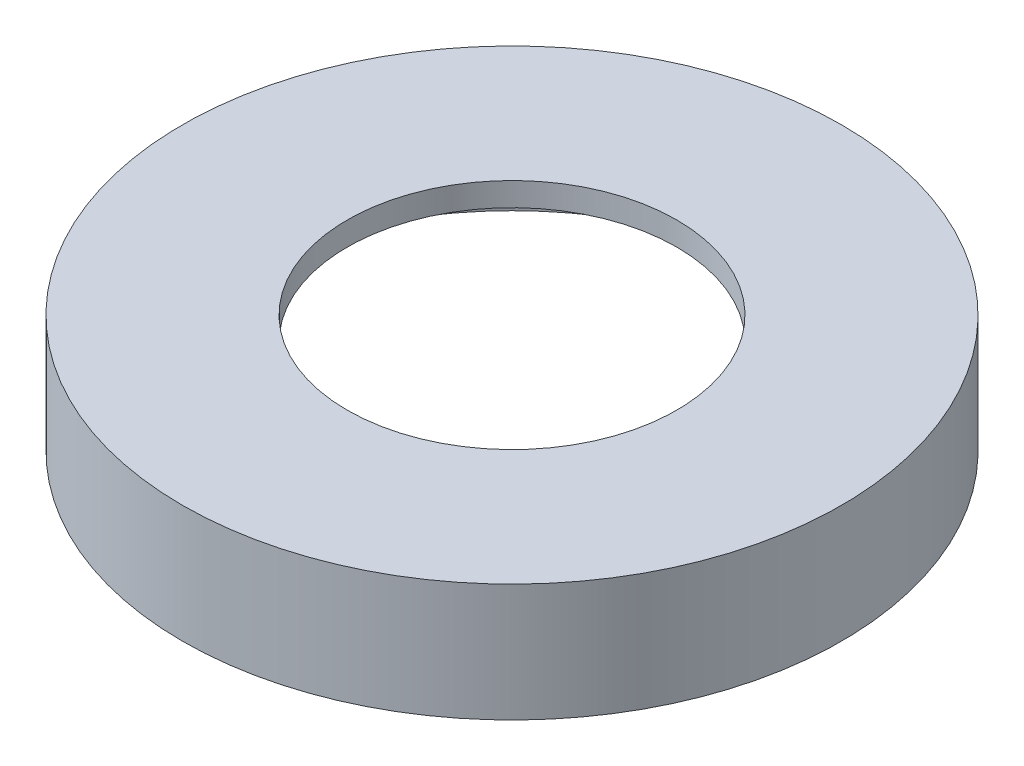
ISO-10303-21;
HEADER;
FILE_DESCRIPTION(('STEP AP214'),'2;1');
FILE_NAME('part.step','',(''),(''),'','','');
FILE_SCHEMA(('AUTOMOTIVE_DESIGN { 1 0 10303 214 1 1 1 1 }'));
ENDSEC;
DATA;
#1=APPLICATION_CONTEXT('core data for automotive mechanical design processes');
#2=APPLICATION_PROTOCOL_DEFINITION('international standard','automotive_design',2000,#1);
#3=PRODUCT_CONTEXT('',#1,'mechanical');
#4=PRODUCT('Part','Part','',(#3));
#5=PRODUCT_RELATED_PRODUCT_CATEGORY('part','',(#4));
#6=PRODUCT_DEFINITION_FORMATION('','',#4);
#7=PRODUCT_DEFINITION_CONTEXT('part definition',#1,'design');
#8=PRODUCT_DEFINITION('design','',#6,#7);
#9=PRODUCT_DEFINITION_SHAPE('','',#8);
#10=(LENGTH_UNIT() NAMED_UNIT(*) SI_UNIT(.MILLI.,.METRE.));
#11=(NAMED_UNIT(*) PLANE_ANGLE_UNIT() SI_UNIT($,.RADIAN.));
#12=(NAMED_UNIT(*) SI_UNIT($,.STERADIAN.) SOLID_ANGLE_UNIT());
#13=UNCERTAINTY_MEASURE_WITH_UNIT(LENGTH_MEASURE(1.E-05),#10,'distance_accuracy_value','');
#14=(GEOMETRIC_REPRESENTATION_CONTEXT(3) GLOBAL_UNCERTAINTY_ASSIGNED_CONTEXT((#13)) GLOBAL_UNIT_ASSIGNED_CONTEXT((#10,
#11,#12)) REPRESENTATION_CONTEXT('',''));
#15=CARTESIAN_POINT('',(0.,0.,0.));
#16=DIRECTION('',(0.,0.,1.));
#17=DIRECTION('',(1.,0.,0.));
#18=AXIS2_PLACEMENT_3D('',#15,#16,#17);
#19=CARTESIAN_POINT('',(0.,5.,0.));
#20=DIRECTION('',(0.,1.,0.));
#21=DIRECTION('',(0.,0.,1.));
#22=AXIS2_PLACEMENT_3D('',#19,#20,#21);
#23=PLANE('',#22);
#24=CARTESIAN_POINT('',(0.,5.,0.));
#25=DIRECTION('',(0.,1.,0.));
#26=DIRECTION('',(0.,0.,1.));
#27=AXIS2_PLACEMENT_3D('',#24,#25,#26);
#28=CIRCLE('',#27,7.);
#29=CARTESIAN_POINT('',(0.,5.,7.));
#30=VERTEX_POINT('',#29);
#31=EDGE_CURVE('E36',#30,#30,#28,.T.);
#32=ORIENTED_EDGE('',*,*,#31,.F.);
#33=EDGE_LOOP('',(#32));
#34=FACE_BOUND('',#33,.T.);
#35=CARTESIAN_POINT('',(0.,5.,0.));
#36=DIRECTION('',(0.,-1.,0.));
#37=DIRECTION('',(0.,0.,-1.));
#38=AXIS2_PLACEMENT_3D('',#35,#36,#37);
#39=CIRCLE('',#38,14.);
#40=CARTESIAN_POINT('',(0.,5.,-14.));
#41=VERTEX_POINT('',#40);
#42=EDGE_CURVE('E10',#41,#41,#39,.T.);
#43=ORIENTED_EDGE('',*,*,#42,.F.);
#44=EDGE_LOOP('',(#43));
#45=FACE_BOUND('',#44,.T.);
#46=ADVANCED_FACE('F33',(#34,#45),#23,.T.);
#47=CARTESIAN_POINT('',(0.,0.,0.));
#48=DIRECTION('',(0.,-1.,0.));
#49=DIRECTION('',(0.,0.,-1.));
#50=AXIS2_PLACEMENT_3D('',#47,#48,#49);
#51=CYLINDRICAL_SURFACE('',#50,14.);
#52=ORIENTED_EDGE('',*,*,#42,.T.);
#53=EDGE_LOOP('',(#52));
#54=FACE_BOUND('',#53,.T.);
#55=CARTESIAN_POINT('',(0.,0.,0.));
#56=DIRECTION('',(0.,-1.,0.));
#57=DIRECTION('',(0.,0.,-1.));
#58=AXIS2_PLACEMENT_3D('',#55,#56,#57);
#59=CIRCLE('',#58,14.);
#60=CARTESIAN_POINT('',(0.,0.,-14.));
#61=VERTEX_POINT('',#60);
#62=EDGE_CURVE('E40',#61,#61,#59,.T.);
#63=ORIENTED_EDGE('',*,*,#62,.F.);
#64=EDGE_LOOP('',(#63));
#65=FACE_BOUND('',#64,.T.);
#66=ADVANCED_FACE('F63',(#54,#65),#51,.T.);
#67=CARTESIAN_POINT('',(14.,0.,0.));
#68=DIRECTION('',(0.,-1.,0.));
#69=DIRECTION('',(0.,0.,-1.));
#70=AXIS2_PLACEMENT_3D('',#67,#68,#69);
#71=PLANE('',#70);
#72=ORIENTED_EDGE('',*,*,#62,.T.);
#73=EDGE_LOOP('',(#72));
#74=FACE_BOUND('',#73,.T.);
#75=CARTESIAN_POINT('',(0.,0.,0.));
#76=DIRECTION('',(0.,-1.,0.));
#77=DIRECTION('',(0.,0.,-1.));
#78=AXIS2_PLACEMENT_3D('',#75,#76,#77);
#79=CIRCLE('',#78,12.5);
#80=CARTESIAN_POINT('',(0.,0.,-12.5));
#81=VERTEX_POINT('',#80);
#82=EDGE_CURVE('E44',#81,#81,#79,.T.);
#83=ORIENTED_EDGE('',*,*,#82,.F.);
#84=EDGE_LOOP('',(#83));
#85=FACE_BOUND('',#84,.T.);
#86=ADVANCED_FACE('F67',(#74,#85),#71,.T.);
#87=CARTESIAN_POINT('',(0.,0.,0.));
#88=DIRECTION('',(0.,-1.,0.));
#89=DIRECTION('',(0.,0.,-1.));
#90=AXIS2_PLACEMENT_3D('',#87,#88,#89);
#91=CYLINDRICAL_SURFACE('',#90,12.5);
#92=ORIENTED_EDGE('',*,*,#82,.T.);
#93=EDGE_LOOP('',(#92));
#94=FACE_BOUND('',#93,.T.);
#95=CARTESIAN_POINT('',(0.,4.,0.));
#96=DIRECTION('',(0.,-1.,0.));
#97=DIRECTION('',(0.,0.,-1.));
#98=AXIS2_PLACEMENT_3D('',#95,#96,#97);
#99=CIRCLE('',#98,12.5);
#100=CARTESIAN_POINT('',(0.,4.,-12.5));
#101=VERTEX_POINT('',#100);
#102=EDGE_CURVE('E49',#101,#101,#99,.T.);
#103=ORIENTED_EDGE('',*,*,#102,.F.);
#104=EDGE_LOOP('',(#103));
#105=FACE_BOUND('',#104,.T.);
#106=ADVANCED_FACE('F71',(#94,#105),#91,.F.);
#107=CARTESIAN_POINT('',(12.5,4.,0.));
#108=DIRECTION('',(0.,-1.,0.));
#109=DIRECTION('',(0.,0.,-1.));
#110=AXIS2_PLACEMENT_3D('',#107,#108,#109);
#111=PLANE('',#110);
#112=CARTESIAN_POINT('',(0.,4.,0.));
#113=DIRECTION('',(0.,-1.,0.));
#114=DIRECTION('',(0.,0.,-1.));
#115=AXIS2_PLACEMENT_3D('',#112,#113,#114);
#116=CIRCLE('',#115,7.);
#117=CARTESIAN_POINT('',(0.,4.,-7.));
#118=VERTEX_POINT('',#117);
#119=EDGE_CURVE('E52',#118,#118,#116,.T.);
#120=ORIENTED_EDGE('',*,*,#119,.F.);
#121=EDGE_LOOP('',(#120));
#122=FACE_BOUND('',#121,.T.);
#123=ORIENTED_EDGE('',*,*,#102,.T.);
#124=EDGE_LOOP('',(#123));
#125=FACE_BOUND('',#124,.T.);
#126=ADVANCED_FACE('F78',(#122,#125),#111,.T.);
#127=CARTESIAN_POINT('',(0.,14.,0.));
#128=DIRECTION('',(0.,-1.,0.));
#129=DIRECTION('',(0.,0.,-1.));
#130=AXIS2_PLACEMENT_3D('',#127,#128,#129);
#131=CYLINDRICAL_SURFACE('',#130,7.);
#132=ORIENTED_EDGE('',*,*,#31,.T.);
#133=EDGE_LOOP('',(#132));
#134=FACE_BOUND('',#133,.T.);
#135=ORIENTED_EDGE('',*,*,#119,.T.);
#136=EDGE_LOOP('',(#135));
#137=FACE_BOUND('',#136,.T.);
#138=ADVANCED_FACE('F59',(#134,#137),#131,.F.);
#139=CLOSED_SHELL('',(#46,#66,#86,#106,#126,#138));
#140=MANIFOLD_SOLID_BREP('B2',#139);
#141=ADVANCED_BREP_SHAPE_REPRESENTATION('',(#18,#140),#14);
#142=SHAPE_DEFINITION_REPRESENTATION(#9,#141);
ENDSEC;
END-ISO-10303-21;
